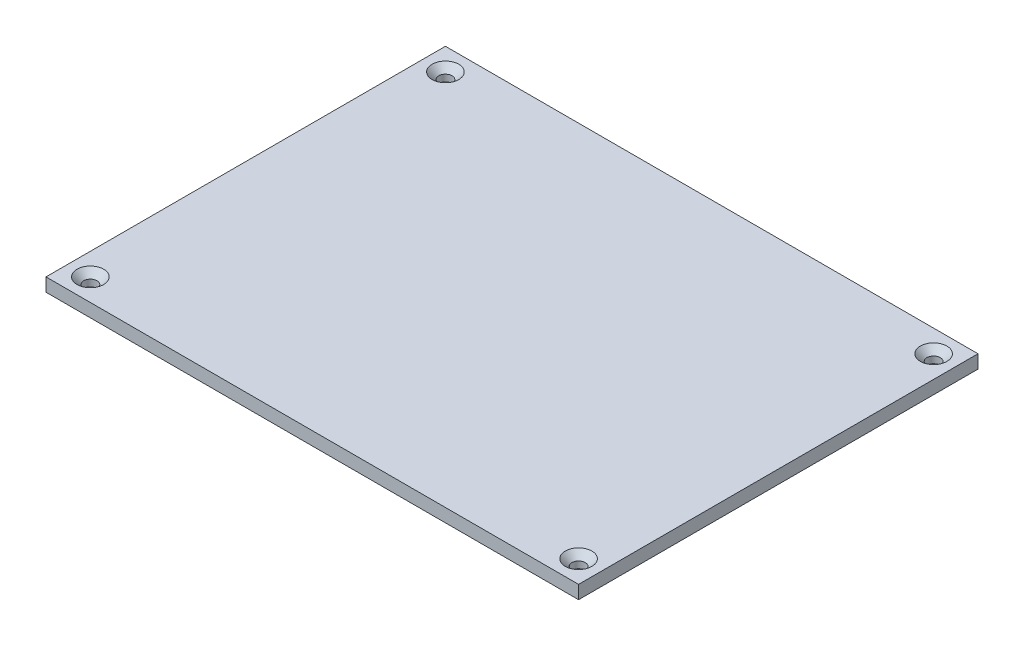
ISO-10303-21;
HEADER;
FILE_DESCRIPTION(('STEP AP214'),'2;1');
FILE_NAME('part.step','',(''),(''),'','','');
FILE_SCHEMA(('AUTOMOTIVE_DESIGN { 1 0 10303 214 1 1 1 1 }'));
ENDSEC;
DATA;
#1=APPLICATION_CONTEXT('core data for automotive mechanical design processes');
#2=APPLICATION_PROTOCOL_DEFINITION('international standard','automotive_design',2000,#1);
#3=PRODUCT_CONTEXT('',#1,'mechanical');
#4=PRODUCT('Part','Part','',(#3));
#5=PRODUCT_RELATED_PRODUCT_CATEGORY('part','',(#4));
#6=PRODUCT_DEFINITION_FORMATION('','',#4);
#7=PRODUCT_DEFINITION_CONTEXT('part definition',#1,'design');
#8=PRODUCT_DEFINITION('design','',#6,#7);
#9=PRODUCT_DEFINITION_SHAPE('','',#8);
#10=(LENGTH_UNIT() NAMED_UNIT(*) SI_UNIT(.MILLI.,.METRE.));
#11=(NAMED_UNIT(*) PLANE_ANGLE_UNIT() SI_UNIT($,.RADIAN.));
#12=(NAMED_UNIT(*) SI_UNIT($,.STERADIAN.) SOLID_ANGLE_UNIT());
#13=UNCERTAINTY_MEASURE_WITH_UNIT(LENGTH_MEASURE(1.E-05),#10,'distance_accuracy_value','');
#14=(GEOMETRIC_REPRESENTATION_CONTEXT(3) GLOBAL_UNCERTAINTY_ASSIGNED_CONTEXT((#13)) GLOBAL_UNIT_ASSIGNED_CONTEXT((#10,
#11,#12)) REPRESENTATION_CONTEXT('',''));
#15=CARTESIAN_POINT('',(0.,0.,0.));
#16=DIRECTION('',(0.,0.,1.));
#17=DIRECTION('',(1.,0.,0.));
#18=AXIS2_PLACEMENT_3D('',#15,#16,#17);
#19=CARTESIAN_POINT('',(0.,3.,0.));
#20=DIRECTION('',(0.,1.,0.));
#21=DIRECTION('',(0.,0.,1.));
#22=AXIS2_PLACEMENT_3D('',#19,#20,#21);
#23=PLANE('',#22);
#24=CARTESIAN_POINT('',(55.,3.,-40.));
#25=DIRECTION('',(0.,1.,0.));
#26=DIRECTION('',(0.,0.,1.));
#27=AXIS2_PLACEMENT_3D('',#24,#25,#26);
#28=CIRCLE('',#27,3.00000000000004);
#29=CARTESIAN_POINT('',(55.,3.,-37.));
#30=VERTEX_POINT('',#29);
#31=EDGE_CURVE('E151',#30,#30,#28,.F.);
#32=ORIENTED_EDGE('',*,*,#31,.T.);
#33=EDGE_LOOP('',(#32));
#34=FACE_BOUND('',#33,.T.);
#35=CARTESIAN_POINT('',(55.,3.,40.));
#36=DIRECTION('',(0.,1.,0.));
#37=DIRECTION('',(0.,0.,1.));
#38=AXIS2_PLACEMENT_3D('',#35,#36,#37);
#39=CIRCLE('',#38,3.);
#40=CARTESIAN_POINT('',(55.,3.,43.));
#41=VERTEX_POINT('',#40);
#42=EDGE_CURVE('E147',#41,#41,#39,.F.);
#43=ORIENTED_EDGE('',*,*,#42,.T.);
#44=EDGE_LOOP('',(#43));
#45=FACE_BOUND('',#44,.T.);
#46=CARTESIAN_POINT('',(-55.,3.,40.));
#47=DIRECTION('',(0.,1.,0.));
#48=DIRECTION('',(0.,0.,1.));
#49=AXIS2_PLACEMENT_3D('',#46,#47,#48);
#50=CIRCLE('',#49,3.00000000000004);
#51=CARTESIAN_POINT('',(-55.,3.,43.));
#52=VERTEX_POINT('',#51);
#53=EDGE_CURVE('E143',#52,#52,#50,.F.);
#54=ORIENTED_EDGE('',*,*,#53,.T.);
#55=EDGE_LOOP('',(#54));
#56=FACE_BOUND('',#55,.T.);
#57=CARTESIAN_POINT('',(-55.,3.,-40.));
#58=DIRECTION('',(0.,1.,0.));
#59=DIRECTION('',(0.,0.,1.));
#60=AXIS2_PLACEMENT_3D('',#57,#58,#59);
#61=CIRCLE('',#60,3.);
#62=CARTESIAN_POINT('',(-55.,3.,-37.));
#63=VERTEX_POINT('',#62);
#64=EDGE_CURVE('E139',#63,#63,#61,.F.);
#65=ORIENTED_EDGE('',*,*,#64,.T.);
#66=EDGE_LOOP('',(#65));
#67=FACE_BOUND('',#66,.T.);
#68=DIRECTION('',(0.,0.,1.));
#69=VECTOR('',#68,1.);
#70=CARTESIAN_POINT('',(-60.,3.,45.));
#71=LINE('',#70,#69);
#72=CARTESIAN_POINT('',(-60.,3.,-45.));
#73=VERTEX_POINT('',#72);
#74=CARTESIAN_POINT('',(-60.,3.,45.));
#75=VERTEX_POINT('',#74);
#76=EDGE_CURVE('E99',#73,#75,#71,.T.);
#77=ORIENTED_EDGE('',*,*,#76,.T.);
#78=DIRECTION('',(1.,0.,0.));
#79=VECTOR('',#78,1.);
#80=CARTESIAN_POINT('',(60.,3.,45.));
#81=LINE('',#80,#79);
#82=CARTESIAN_POINT('',(60.,3.,45.));
#83=VERTEX_POINT('',#82);
#84=EDGE_CURVE('E95',#75,#83,#81,.T.);
#85=ORIENTED_EDGE('',*,*,#84,.T.);
#86=DIRECTION('',(0.,0.,-1.));
#87=VECTOR('',#86,1.);
#88=CARTESIAN_POINT('',(60.,3.,45.));
#89=LINE('',#88,#87);
#90=CARTESIAN_POINT('',(60.,3.,-45.));
#91=VERTEX_POINT('',#90);
#92=EDGE_CURVE('E97',#83,#91,#89,.T.);
#93=ORIENTED_EDGE('',*,*,#92,.T.);
#94=DIRECTION('',(-1.,0.,0.));
#95=VECTOR('',#94,1.);
#96=CARTESIAN_POINT('',(60.,3.,-45.));
#97=LINE('',#96,#95);
#98=EDGE_CURVE('E64',#91,#73,#97,.T.);
#99=ORIENTED_EDGE('',*,*,#98,.T.);
#100=EDGE_LOOP('',(#77,#85,#93,#99));
#101=FACE_BOUND('',#100,.T.);
#102=ADVANCED_FACE('F45',(#34,#45,#56,#67,#101),#23,.T.);
#103=CARTESIAN_POINT('',(0.,0.,0.));
#104=DIRECTION('',(0.,1.,0.));
#105=DIRECTION('',(0.,0.,1.));
#106=AXIS2_PLACEMENT_3D('',#103,#104,#105);
#107=PLANE('',#106);
#108=DIRECTION('',(0.,0.,1.));
#109=VECTOR('',#108,1.);
#110=CARTESIAN_POINT('',(-60.,0.,45.));
#111=LINE('',#110,#109);
#112=CARTESIAN_POINT('',(-60.,0.,-45.));
#113=VERTEX_POINT('',#112);
#114=CARTESIAN_POINT('',(-60.,0.,45.));
#115=VERTEX_POINT('',#114);
#116=EDGE_CURVE('E118',#113,#115,#111,.T.);
#117=ORIENTED_EDGE('',*,*,#116,.F.);
#118=DIRECTION('',(-1.,0.,0.));
#119=VECTOR('',#118,1.);
#120=CARTESIAN_POINT('',(60.,0.,-45.));
#121=LINE('',#120,#119);
#122=CARTESIAN_POINT('',(60.,0.,-45.));
#123=VERTEX_POINT('',#122);
#124=EDGE_CURVE('E87',#123,#113,#121,.T.);
#125=ORIENTED_EDGE('',*,*,#124,.F.);
#126=DIRECTION('',(0.,0.,-1.));
#127=VECTOR('',#126,1.);
#128=CARTESIAN_POINT('',(60.,0.,45.));
#129=LINE('',#128,#127);
#130=CARTESIAN_POINT('',(60.,0.,45.));
#131=VERTEX_POINT('',#130);
#132=EDGE_CURVE('E81',#131,#123,#129,.T.);
#133=ORIENTED_EDGE('',*,*,#132,.F.);
#134=DIRECTION('',(1.,0.,0.));
#135=VECTOR('',#134,1.);
#136=CARTESIAN_POINT('',(60.,0.,45.));
#137=LINE('',#136,#135);
#138=EDGE_CURVE('E105',#115,#131,#137,.T.);
#139=ORIENTED_EDGE('',*,*,#138,.F.);
#140=EDGE_LOOP('',(#117,#125,#133,#139));
#141=FACE_BOUND('',#140,.T.);
#142=CARTESIAN_POINT('',(-55.,0.,-40.));
#143=DIRECTION('',(0.,1.,0.));
#144=DIRECTION('',(0.,0.,1.));
#145=AXIS2_PLACEMENT_3D('',#142,#143,#144);
#146=CIRCLE('',#145,1.5);
#147=CARTESIAN_POINT('',(-55.,0.,-38.5));
#148=VERTEX_POINT('',#147);
#149=EDGE_CURVE('E122',#148,#148,#146,.T.);
#150=ORIENTED_EDGE('',*,*,#149,.T.);
#151=EDGE_LOOP('',(#150));
#152=FACE_BOUND('',#151,.T.);
#153=CARTESIAN_POINT('',(-55.,0.,40.));
#154=DIRECTION('',(0.,1.,0.));
#155=DIRECTION('',(0.,0.,1.));
#156=AXIS2_PLACEMENT_3D('',#153,#154,#155);
#157=CIRCLE('',#156,1.5);
#158=CARTESIAN_POINT('',(-55.,0.,41.5));
#159=VERTEX_POINT('',#158);
#160=EDGE_CURVE('E236',#159,#159,#157,.T.);
#161=ORIENTED_EDGE('',*,*,#160,.T.);
#162=EDGE_LOOP('',(#161));
#163=FACE_BOUND('',#162,.T.);
#164=CARTESIAN_POINT('',(55.,0.,40.));
#165=DIRECTION('',(0.,1.,0.));
#166=DIRECTION('',(0.,0.,1.));
#167=AXIS2_PLACEMENT_3D('',#164,#165,#166);
#168=CIRCLE('',#167,1.5);
#169=CARTESIAN_POINT('',(55.,0.,41.5));
#170=VERTEX_POINT('',#169);
#171=EDGE_CURVE('E232',#170,#170,#168,.T.);
#172=ORIENTED_EDGE('',*,*,#171,.T.);
#173=EDGE_LOOP('',(#172));
#174=FACE_BOUND('',#173,.T.);
#175=CARTESIAN_POINT('',(55.,0.,-40.));
#176=DIRECTION('',(0.,1.,0.));
#177=DIRECTION('',(0.,0.,1.));
#178=AXIS2_PLACEMENT_3D('',#175,#176,#177);
#179=CIRCLE('',#178,1.5);
#180=CARTESIAN_POINT('',(55.,0.,-38.5));
#181=VERTEX_POINT('',#180);
#182=EDGE_CURVE('E229',#181,#181,#179,.T.);
#183=ORIENTED_EDGE('',*,*,#182,.T.);
#184=EDGE_LOOP('',(#183));
#185=FACE_BOUND('',#184,.T.);
#186=ADVANCED_FACE('F180',(#141,#152,#163,#174,#185),#107,.F.);
#187=CARTESIAN_POINT('',(-60.,3.,45.));
#188=DIRECTION('',(1.,0.,0.));
#189=DIRECTION('',(0.,0.,-1.));
#190=AXIS2_PLACEMENT_3D('',#187,#188,#189);
#191=PLANE('',#190);
#192=ORIENTED_EDGE('',*,*,#116,.T.);
#193=DIRECTION('',(0.,-1.,0.));
#194=VECTOR('',#193,1.);
#195=CARTESIAN_POINT('',(-60.,3.,45.));
#196=LINE('',#195,#194);
#197=EDGE_CURVE('E107',#75,#115,#196,.T.);
#198=ORIENTED_EDGE('',*,*,#197,.F.);
#199=ORIENTED_EDGE('',*,*,#76,.F.);
#200=DIRECTION('',(0.,-1.,0.));
#201=VECTOR('',#200,1.);
#202=CARTESIAN_POINT('',(-60.,3.,-45.));
#203=LINE('',#202,#201);
#204=EDGE_CURVE('E114',#73,#113,#203,.T.);
#205=ORIENTED_EDGE('',*,*,#204,.T.);
#206=EDGE_LOOP('',(#192,#198,#199,#205));
#207=FACE_BOUND('',#206,.T.);
#208=ADVANCED_FACE('F186',(#207),#191,.F.);
#209=CARTESIAN_POINT('',(60.,3.,45.));
#210=DIRECTION('',(0.,0.,-1.));
#211=DIRECTION('',(-1.,0.,0.));
#212=AXIS2_PLACEMENT_3D('',#209,#210,#211);
#213=PLANE('',#212);
#214=ORIENTED_EDGE('',*,*,#138,.T.);
#215=DIRECTION('',(0.,-1.,0.));
#216=VECTOR('',#215,1.);
#217=CARTESIAN_POINT('',(60.,3.,45.));
#218=LINE('',#217,#216);
#219=EDGE_CURVE('E103',#83,#131,#218,.T.);
#220=ORIENTED_EDGE('',*,*,#219,.F.);
#221=ORIENTED_EDGE('',*,*,#84,.F.);
#222=ORIENTED_EDGE('',*,*,#197,.T.);
#223=EDGE_LOOP('',(#214,#220,#221,#222));
#224=FACE_BOUND('',#223,.T.);
#225=ADVANCED_FACE('F104',(#224),#213,.F.);
#226=CARTESIAN_POINT('',(60.,3.,45.));
#227=DIRECTION('',(-1.,0.,0.));
#228=DIRECTION('',(0.,0.,1.));
#229=AXIS2_PLACEMENT_3D('',#226,#227,#228);
#230=PLANE('',#229);
#231=ORIENTED_EDGE('',*,*,#132,.T.);
#232=DIRECTION('',(0.,-1.,0.));
#233=VECTOR('',#232,1.);
#234=CARTESIAN_POINT('',(60.,3.,-45.));
#235=LINE('',#234,#233);
#236=EDGE_CURVE('E108',#91,#123,#235,.T.);
#237=ORIENTED_EDGE('',*,*,#236,.F.);
#238=ORIENTED_EDGE('',*,*,#92,.F.);
#239=ORIENTED_EDGE('',*,*,#219,.T.);
#240=EDGE_LOOP('',(#231,#237,#238,#239));
#241=FACE_BOUND('',#240,.T.);
#242=ADVANCED_FACE('F110',(#241),#230,.F.);
#243=CARTESIAN_POINT('',(60.,3.,-45.));
#244=DIRECTION('',(0.,0.,1.));
#245=DIRECTION('',(1.,0.,0.));
#246=AXIS2_PLACEMENT_3D('',#243,#244,#245);
#247=PLANE('',#246);
#248=ORIENTED_EDGE('',*,*,#124,.T.);
#249=ORIENTED_EDGE('',*,*,#204,.F.);
#250=ORIENTED_EDGE('',*,*,#98,.F.);
#251=ORIENTED_EDGE('',*,*,#236,.T.);
#252=EDGE_LOOP('',(#248,#249,#250,#251));
#253=FACE_BOUND('',#252,.T.);
#254=ADVANCED_FACE('F194',(#253),#247,.F.);
#255=CARTESIAN_POINT('',(-55.,3.,-40.));
#256=DIRECTION('',(0.,-1.,0.));
#257=DIRECTION('',(0.,0.,-1.));
#258=AXIS2_PLACEMENT_3D('',#255,#256,#257);
#259=CYLINDRICAL_SURFACE('',#258,1.5);
#260=CARTESIAN_POINT('',(-55.,1.50000000000001,-40.));
#261=DIRECTION('',(0.,1.,0.));
#262=DIRECTION('',(0.,0.,1.));
#263=AXIS2_PLACEMENT_3D('',#260,#261,#262);
#264=CIRCLE('',#263,1.5);
#265=CARTESIAN_POINT('',(-55.,1.50000000000001,-38.5));
#266=VERTEX_POINT('',#265);
#267=EDGE_CURVE('E11',#266,#266,#264,.T.);
#268=ORIENTED_EDGE('',*,*,#267,.T.);
#269=EDGE_LOOP('',(#268));
#270=FACE_BOUND('',#269,.T.);
#271=ORIENTED_EDGE('',*,*,#149,.F.);
#272=EDGE_LOOP('',(#271));
#273=FACE_BOUND('',#272,.T.);
#274=ADVANCED_FACE('F191',(#270,#273),#259,.F.);
#275=CARTESIAN_POINT('',(-55.,3.,40.));
#276=DIRECTION('',(0.,-1.,0.));
#277=DIRECTION('',(0.,0.,-1.));
#278=AXIS2_PLACEMENT_3D('',#275,#276,#277);
#279=CYLINDRICAL_SURFACE('',#278,1.5);
#280=CARTESIAN_POINT('',(-55.,1.49999999999998,40.));
#281=DIRECTION('',(0.,1.,0.));
#282=DIRECTION('',(0.,0.,1.));
#283=AXIS2_PLACEMENT_3D('',#280,#281,#282);
#284=CIRCLE('',#283,1.5);
#285=CARTESIAN_POINT('',(-55.,1.49999999999998,41.5));
#286=VERTEX_POINT('',#285);
#287=EDGE_CURVE('E56',#286,#286,#284,.T.);
#288=ORIENTED_EDGE('',*,*,#287,.T.);
#289=EDGE_LOOP('',(#288));
#290=FACE_BOUND('',#289,.T.);
#291=ORIENTED_EDGE('',*,*,#160,.F.);
#292=EDGE_LOOP('',(#291));
#293=FACE_BOUND('',#292,.T.);
#294=ADVANCED_FACE('F162',(#290,#293),#279,.F.);
#295=CARTESIAN_POINT('',(55.,3.,40.));
#296=DIRECTION('',(0.,-1.,0.));
#297=DIRECTION('',(0.,0.,-1.));
#298=AXIS2_PLACEMENT_3D('',#295,#296,#297);
#299=CYLINDRICAL_SURFACE('',#298,1.5);
#300=CARTESIAN_POINT('',(55.,1.50000000000001,40.));
#301=DIRECTION('',(0.,1.,0.));
#302=DIRECTION('',(0.,0.,1.));
#303=AXIS2_PLACEMENT_3D('',#300,#301,#302);
#304=CIRCLE('',#303,1.5);
#305=CARTESIAN_POINT('',(55.,1.50000000000001,41.5));
#306=VERTEX_POINT('',#305);
#307=EDGE_CURVE('E155',#306,#306,#304,.T.);
#308=ORIENTED_EDGE('',*,*,#307,.T.);
#309=EDGE_LOOP('',(#308));
#310=FACE_BOUND('',#309,.T.);
#311=ORIENTED_EDGE('',*,*,#171,.F.);
#312=EDGE_LOOP('',(#311));
#313=FACE_BOUND('',#312,.T.);
#314=ADVANCED_FACE('F220',(#310,#313),#299,.F.);
#315=CARTESIAN_POINT('',(55.,3.,-40.));
#316=DIRECTION('',(0.,-1.,0.));
#317=DIRECTION('',(0.,0.,-1.));
#318=AXIS2_PLACEMENT_3D('',#315,#316,#317);
#319=CYLINDRICAL_SURFACE('',#318,1.5);
#320=CARTESIAN_POINT('',(55.,1.49999999999998,-40.));
#321=DIRECTION('',(0.,1.,0.));
#322=DIRECTION('',(0.,0.,1.));
#323=AXIS2_PLACEMENT_3D('',#320,#321,#322);
#324=CIRCLE('',#323,1.5);
#325=CARTESIAN_POINT('',(55.,1.49999999999998,-38.5));
#326=VERTEX_POINT('',#325);
#327=EDGE_CURVE('E135',#326,#326,#324,.T.);
#328=ORIENTED_EDGE('',*,*,#327,.T.);
#329=EDGE_LOOP('',(#328));
#330=FACE_BOUND('',#329,.T.);
#331=ORIENTED_EDGE('',*,*,#182,.F.);
#332=EDGE_LOOP('',(#331));
#333=FACE_BOUND('',#332,.T.);
#334=ADVANCED_FACE('F209',(#330,#333),#319,.F.);
#335=CARTESIAN_POINT('',(55.,1.49999999999998,-40.));
#336=DIRECTION('',(0.,1.,0.));
#337=DIRECTION('',(0.,0.,1.));
#338=AXIS2_PLACEMENT_3D('',#335,#336,#337);
#339=CONICAL_SURFACE('',#338,1.5,0.785398163397456);
#340=ORIENTED_EDGE('',*,*,#31,.F.);
#341=EDGE_LOOP('',(#340));
#342=FACE_BOUND('',#341,.T.);
#343=ORIENTED_EDGE('',*,*,#327,.F.);
#344=EDGE_LOOP('',(#343));
#345=FACE_BOUND('',#344,.T.);
#346=ADVANCED_FACE('F174',(#342,#345),#339,.F.);
#347=CARTESIAN_POINT('',(55.,1.50000000000001,40.));
#348=DIRECTION('',(0.,1.,0.));
#349=DIRECTION('',(0.,0.,1.));
#350=AXIS2_PLACEMENT_3D('',#347,#348,#349);
#351=CONICAL_SURFACE('',#350,1.5,0.785398163397451);
#352=ORIENTED_EDGE('',*,*,#42,.F.);
#353=EDGE_LOOP('',(#352));
#354=FACE_BOUND('',#353,.T.);
#355=ORIENTED_EDGE('',*,*,#307,.F.);
#356=EDGE_LOOP('',(#355));
#357=FACE_BOUND('',#356,.T.);
#358=ADVANCED_FACE('F167',(#354,#357),#351,.F.);
#359=CARTESIAN_POINT('',(-55.,1.49999999999998,40.));
#360=DIRECTION('',(0.,1.,0.));
#361=DIRECTION('',(0.,0.,1.));
#362=AXIS2_PLACEMENT_3D('',#359,#360,#361);
#363=CONICAL_SURFACE('',#362,1.5,0.785398163397456);
#364=ORIENTED_EDGE('',*,*,#53,.F.);
#365=EDGE_LOOP('',(#364));
#366=FACE_BOUND('',#365,.T.);
#367=ORIENTED_EDGE('',*,*,#287,.F.);
#368=EDGE_LOOP('',(#367));
#369=FACE_BOUND('',#368,.T.);
#370=ADVANCED_FACE('F165',(#366,#369),#363,.F.);
#371=CARTESIAN_POINT('',(-55.,1.50000000000001,-40.));
#372=DIRECTION('',(0.,1.,0.));
#373=DIRECTION('',(0.,0.,1.));
#374=AXIS2_PLACEMENT_3D('',#371,#372,#373);
#375=CONICAL_SURFACE('',#374,1.5,0.785398163397451);
#376=ORIENTED_EDGE('',*,*,#64,.F.);
#377=EDGE_LOOP('',(#376));
#378=FACE_BOUND('',#377,.T.);
#379=ORIENTED_EDGE('',*,*,#267,.F.);
#380=EDGE_LOOP('',(#379));
#381=FACE_BOUND('',#380,.T.);
#382=ADVANCED_FACE('F48',(#378,#381),#375,.F.);
#383=CLOSED_SHELL('',(#102,#186,#208,#225,#242,#254,#274,#294,#314,#334,#346,#358,#370,#382));
#384=MANIFOLD_SOLID_BREP('B2',#383);
#385=ADVANCED_BREP_SHAPE_REPRESENTATION('',(#18,#384),#14);
#386=SHAPE_DEFINITION_REPRESENTATION(#9,#385);
ENDSEC;
END-ISO-10303-21;
